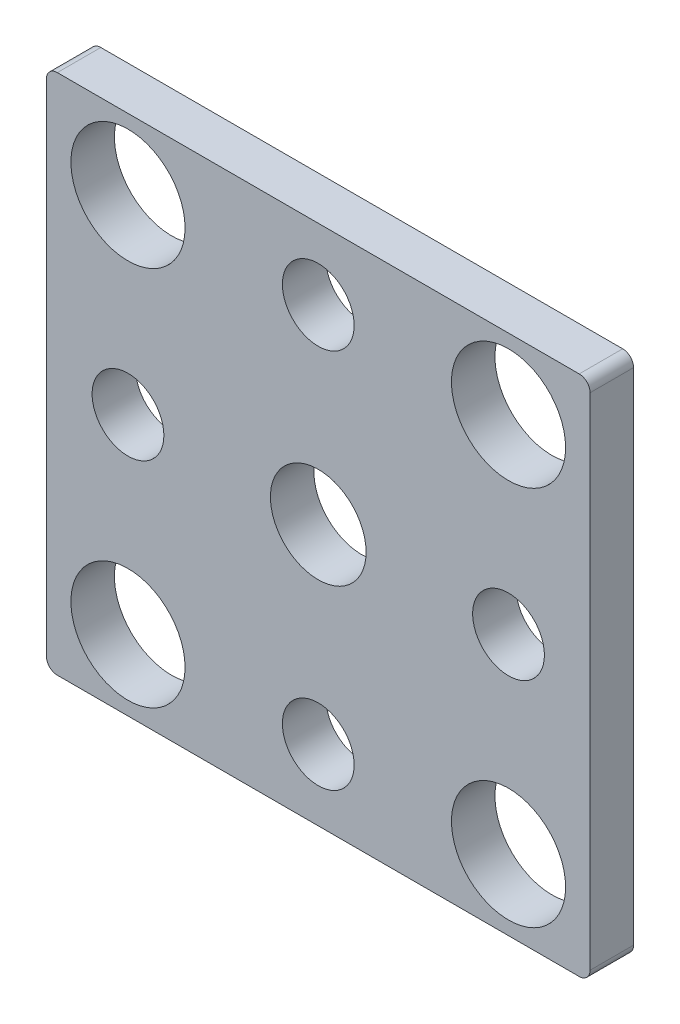
ISO-10303-21;
HEADER;
FILE_DESCRIPTION(('STEP AP214'),'2;1');
FILE_NAME('part.step','',(''),(''),'','','');
FILE_SCHEMA(('AUTOMOTIVE_DESIGN { 1 0 10303 214 1 1 1 1 }'));
ENDSEC;
DATA;
#1=APPLICATION_CONTEXT('core data for automotive mechanical design processes');
#2=APPLICATION_PROTOCOL_DEFINITION('international standard','automotive_design',2000,#1);
#3=PRODUCT_CONTEXT('',#1,'mechanical');
#4=PRODUCT('Part','Part','',(#3));
#5=PRODUCT_RELATED_PRODUCT_CATEGORY('part','',(#4));
#6=PRODUCT_DEFINITION_FORMATION('','',#4);
#7=PRODUCT_DEFINITION_CONTEXT('part definition',#1,'design');
#8=PRODUCT_DEFINITION('design','',#6,#7);
#9=PRODUCT_DEFINITION_SHAPE('','',#8);
#10=(LENGTH_UNIT() NAMED_UNIT(*) SI_UNIT(.MILLI.,.METRE.));
#11=(NAMED_UNIT(*) PLANE_ANGLE_UNIT() SI_UNIT($,.RADIAN.));
#12=(NAMED_UNIT(*) SI_UNIT($,.STERADIAN.) SOLID_ANGLE_UNIT());
#13=UNCERTAINTY_MEASURE_WITH_UNIT(LENGTH_MEASURE(1.E-05),#10,'distance_accuracy_value','');
#14=(GEOMETRIC_REPRESENTATION_CONTEXT(3) GLOBAL_UNCERTAINTY_ASSIGNED_CONTEXT((#13)) GLOBAL_UNIT_ASSIGNED_CONTEXT((#10,
#11,#12)) REPRESENTATION_CONTEXT('',''));
#15=CARTESIAN_POINT('',(0.,0.,0.));
#16=DIRECTION('',(0.,0.,1.));
#17=DIRECTION('',(1.,0.,0.));
#18=AXIS2_PLACEMENT_3D('',#15,#16,#17);
#19=CARTESIAN_POINT('',(0.,0.,4.));
#20=DIRECTION('',(0.,0.,-1.));
#21=DIRECTION('',(-1.,0.,0.));
#22=AXIS2_PLACEMENT_3D('',#19,#20,#21);
#23=PLANE('',#22);
#24=CARTESIAN_POINT('',(7.5,-24.,4.));
#25=DIRECTION('',(0.,0.,1.));
#26=DIRECTION('',(1.,0.,0.));
#27=AXIS2_PLACEMENT_3D('',#24,#25,#26);
#28=CIRCLE('',#27,3.3);
#29=CARTESIAN_POINT('',(10.8,-24.,4.));
#30=VERTEX_POINT('',#29);
#31=EDGE_CURVE('E230',#30,#30,#28,.T.);
#32=ORIENTED_EDGE('',*,*,#31,.F.);
#33=EDGE_LOOP('',(#32));
#34=FACE_BOUND('',#33,.T.);
#35=CARTESIAN_POINT('',(42.5,-24.,4.));
#36=DIRECTION('',(0.,0.,1.));
#37=DIRECTION('',(1.,0.,0.));
#38=AXIS2_PLACEMENT_3D('',#35,#36,#37);
#39=CIRCLE('',#38,3.3);
#40=CARTESIAN_POINT('',(45.8,-24.,4.));
#41=VERTEX_POINT('',#40);
#42=EDGE_CURVE('E224',#41,#41,#39,.T.);
#43=ORIENTED_EDGE('',*,*,#42,.F.);
#44=EDGE_LOOP('',(#43));
#45=FACE_BOUND('',#44,.T.);
#46=CARTESIAN_POINT('',(25.,-6.5,4.));
#47=DIRECTION('',(0.,0.,1.));
#48=DIRECTION('',(1.,0.,0.));
#49=AXIS2_PLACEMENT_3D('',#46,#47,#48);
#50=CIRCLE('',#49,3.3);
#51=CARTESIAN_POINT('',(28.3,-6.5,4.));
#52=VERTEX_POINT('',#51);
#53=EDGE_CURVE('E218',#52,#52,#50,.T.);
#54=ORIENTED_EDGE('',*,*,#53,.F.);
#55=EDGE_LOOP('',(#54));
#56=FACE_BOUND('',#55,.T.);
#57=CARTESIAN_POINT('',(25.,-41.5,4.));
#58=DIRECTION('',(0.,0.,1.));
#59=DIRECTION('',(1.,0.,0.));
#60=AXIS2_PLACEMENT_3D('',#57,#58,#59);
#61=CIRCLE('',#60,3.3);
#62=CARTESIAN_POINT('',(28.3,-41.5,4.));
#63=VERTEX_POINT('',#62);
#64=EDGE_CURVE('E212',#63,#63,#61,.T.);
#65=ORIENTED_EDGE('',*,*,#64,.F.);
#66=EDGE_LOOP('',(#65));
#67=FACE_BOUND('',#66,.T.);
#68=CARTESIAN_POINT('',(7.50000000000001,-41.5,4.));
#69=DIRECTION('',(0.,0.,1.));
#70=DIRECTION('',(1.,0.,0.));
#71=AXIS2_PLACEMENT_3D('',#68,#69,#70);
#72=CIRCLE('',#71,5.25);
#73=CARTESIAN_POINT('',(12.75,-41.5,4.));
#74=VERTEX_POINT('',#73);
#75=EDGE_CURVE('E195',#74,#74,#72,.T.);
#76=ORIENTED_EDGE('',*,*,#75,.F.);
#77=EDGE_LOOP('',(#76));
#78=FACE_BOUND('',#77,.T.);
#79=CARTESIAN_POINT('',(42.5,-41.5,4.));
#80=DIRECTION('',(0.,0.,1.));
#81=DIRECTION('',(1.,0.,0.));
#82=AXIS2_PLACEMENT_3D('',#79,#80,#81);
#83=CIRCLE('',#82,5.25);
#84=CARTESIAN_POINT('',(47.75,-41.5,4.));
#85=VERTEX_POINT('',#84);
#86=EDGE_CURVE('E201',#85,#85,#83,.F.);
#87=ORIENTED_EDGE('',*,*,#86,.T.);
#88=EDGE_LOOP('',(#87));
#89=FACE_BOUND('',#88,.T.);
#90=DIRECTION('',(1.,0.,0.));
#91=VECTOR('',#90,1.);
#92=CARTESIAN_POINT('',(50.,-48.,4.));
#93=LINE('',#92,#91);
#94=CARTESIAN_POINT('',(1.,-48.,4.));
#95=VERTEX_POINT('',#94);
#96=CARTESIAN_POINT('',(49.,-48.,4.));
#97=VERTEX_POINT('',#96);
#98=EDGE_CURVE('E172',#95,#97,#93,.T.);
#99=ORIENTED_EDGE('',*,*,#98,.T.);
#100=CARTESIAN_POINT('',(49.,-47.,4.));
#101=DIRECTION('',(0.,0.,-1.));
#102=DIRECTION('',(-1.,0.,0.));
#103=AXIS2_PLACEMENT_3D('',#100,#101,#102);
#104=CIRCLE('',#103,1.);
#105=CARTESIAN_POINT('',(50.,-47.,4.));
#106=VERTEX_POINT('',#105);
#107=EDGE_CURVE('E150',#97,#106,#104,.F.);
#108=ORIENTED_EDGE('',*,*,#107,.T.);
#109=DIRECTION('',(0.,1.,0.));
#110=VECTOR('',#109,1.);
#111=CARTESIAN_POINT('',(50.,0.,4.));
#112=LINE('',#111,#110);
#113=CARTESIAN_POINT('',(50.,-1.,4.));
#114=VERTEX_POINT('',#113);
#115=EDGE_CURVE('E120',#106,#114,#112,.T.);
#116=ORIENTED_EDGE('',*,*,#115,.T.);
#117=CARTESIAN_POINT('',(49.,-1.,4.));
#118=DIRECTION('',(0.,0.,-1.));
#119=DIRECTION('',(-1.,0.,0.));
#120=AXIS2_PLACEMENT_3D('',#117,#118,#119);
#121=CIRCLE('',#120,1.);
#122=CARTESIAN_POINT('',(49.,0.,4.));
#123=VERTEX_POINT('',#122);
#124=EDGE_CURVE('E56',#114,#123,#121,.F.);
#125=ORIENTED_EDGE('',*,*,#124,.T.);
#126=DIRECTION('',(-1.,0.,0.));
#127=VECTOR('',#126,1.);
#128=CARTESIAN_POINT('',(0.,0.,4.));
#129=LINE('',#128,#127);
#130=CARTESIAN_POINT('',(1.,0.,4.));
#131=VERTEX_POINT('',#130);
#132=EDGE_CURVE('E136',#123,#131,#129,.T.);
#133=ORIENTED_EDGE('',*,*,#132,.T.);
#134=CARTESIAN_POINT('',(1.,-1.,4.));
#135=DIRECTION('',(0.,0.,-1.));
#136=DIRECTION('',(-1.,0.,0.));
#137=AXIS2_PLACEMENT_3D('',#134,#135,#136);
#138=CIRCLE('',#137,1.);
#139=CARTESIAN_POINT('',(0.,-1.00000000000001,4.));
#140=VERTEX_POINT('',#139);
#141=EDGE_CURVE('E146',#131,#140,#138,.F.);
#142=ORIENTED_EDGE('',*,*,#141,.T.);
#143=DIRECTION('',(0.,-1.,0.));
#144=VECTOR('',#143,1.);
#145=CARTESIAN_POINT('',(0.,-48.,4.));
#146=LINE('',#145,#144);
#147=CARTESIAN_POINT('',(0.,-47.,4.));
#148=VERTEX_POINT('',#147);
#149=EDGE_CURVE('E130',#140,#148,#146,.T.);
#150=ORIENTED_EDGE('',*,*,#149,.T.);
#151=CARTESIAN_POINT('',(1.,-47.,4.));
#152=DIRECTION('',(0.,0.,-1.));
#153=DIRECTION('',(-1.,0.,0.));
#154=AXIS2_PLACEMENT_3D('',#151,#152,#153);
#155=CIRCLE('',#154,1.);
#156=EDGE_CURVE('E148',#148,#95,#155,.F.);
#157=ORIENTED_EDGE('',*,*,#156,.T.);
#158=EDGE_LOOP('',(#99,#108,#116,#125,#133,#142,#150,#157));
#159=FACE_BOUND('',#158,.T.);
#160=CARTESIAN_POINT('',(7.50000000000001,-6.5,4.));
#161=DIRECTION('',(0.,0.,1.));
#162=DIRECTION('',(1.,0.,0.));
#163=AXIS2_PLACEMENT_3D('',#160,#161,#162);
#164=CIRCLE('',#163,5.25);
#165=CARTESIAN_POINT('',(12.75,-6.5,4.));
#166=VERTEX_POINT('',#165);
#167=EDGE_CURVE('E177',#166,#166,#164,.F.);
#168=ORIENTED_EDGE('',*,*,#167,.T.);
#169=EDGE_LOOP('',(#168));
#170=FACE_BOUND('',#169,.T.);
#171=CARTESIAN_POINT('',(42.5,-6.5,4.));
#172=DIRECTION('',(0.,0.,1.));
#173=DIRECTION('',(1.,0.,0.));
#174=AXIS2_PLACEMENT_3D('',#171,#172,#173);
#175=CIRCLE('',#174,5.25);
#176=CARTESIAN_POINT('',(47.75,-6.5,4.));
#177=VERTEX_POINT('',#176);
#178=EDGE_CURVE('E207',#177,#177,#175,.T.);
#179=ORIENTED_EDGE('',*,*,#178,.F.);
#180=EDGE_LOOP('',(#179));
#181=FACE_BOUND('',#180,.T.);
#182=CARTESIAN_POINT('',(25.,-24.,4.));
#183=DIRECTION('',(0.,0.,1.));
#184=DIRECTION('',(1.,0.,0.));
#185=AXIS2_PLACEMENT_3D('',#182,#183,#184);
#186=CIRCLE('',#185,4.4);
#187=CARTESIAN_POINT('',(29.4,-24.,4.));
#188=VERTEX_POINT('',#187);
#189=EDGE_CURVE('E188',#188,#188,#186,.T.);
#190=ORIENTED_EDGE('',*,*,#189,.F.);
#191=EDGE_LOOP('',(#190));
#192=FACE_BOUND('',#191,.T.);
#193=ADVANCED_FACE('F36',(#34,#45,#56,#67,#78,#89,#159,#170,#181,#192),#23,.F.);
#194=CARTESIAN_POINT('',(0.,0.,0.));
#195=DIRECTION('',(0.,0.,-1.));
#196=DIRECTION('',(-1.,0.,0.));
#197=AXIS2_PLACEMENT_3D('',#194,#195,#196);
#198=PLANE('',#197);
#199=CARTESIAN_POINT('',(7.5,-24.,0.));
#200=DIRECTION('',(0.,0.,1.));
#201=DIRECTION('',(1.,0.,0.));
#202=AXIS2_PLACEMENT_3D('',#199,#200,#201);
#203=CIRCLE('',#202,3.3);
#204=CARTESIAN_POINT('',(10.8,-24.,0.));
#205=VERTEX_POINT('',#204);
#206=EDGE_CURVE('E192',#205,#205,#203,.T.);
#207=ORIENTED_EDGE('',*,*,#206,.T.);
#208=EDGE_LOOP('',(#207));
#209=FACE_BOUND('',#208,.T.);
#210=CARTESIAN_POINT('',(42.5,-24.,0.));
#211=DIRECTION('',(0.,0.,1.));
#212=DIRECTION('',(1.,0.,0.));
#213=AXIS2_PLACEMENT_3D('',#210,#211,#212);
#214=CIRCLE('',#213,3.3);
#215=CARTESIAN_POINT('',(45.8,-24.,0.));
#216=VERTEX_POINT('',#215);
#217=EDGE_CURVE('E227',#216,#216,#214,.T.);
#218=ORIENTED_EDGE('',*,*,#217,.T.);
#219=EDGE_LOOP('',(#218));
#220=FACE_BOUND('',#219,.T.);
#221=CARTESIAN_POINT('',(25.,-6.5,0.));
#222=DIRECTION('',(0.,0.,1.));
#223=DIRECTION('',(1.,0.,0.));
#224=AXIS2_PLACEMENT_3D('',#221,#222,#223);
#225=CIRCLE('',#224,3.3);
#226=CARTESIAN_POINT('',(28.3,-6.5,0.));
#227=VERTEX_POINT('',#226);
#228=EDGE_CURVE('E221',#227,#227,#225,.T.);
#229=ORIENTED_EDGE('',*,*,#228,.T.);
#230=EDGE_LOOP('',(#229));
#231=FACE_BOUND('',#230,.T.);
#232=CARTESIAN_POINT('',(25.,-41.5,0.));
#233=DIRECTION('',(0.,0.,1.));
#234=DIRECTION('',(1.,0.,0.));
#235=AXIS2_PLACEMENT_3D('',#232,#233,#234);
#236=CIRCLE('',#235,3.3);
#237=CARTESIAN_POINT('',(28.3,-41.5,0.));
#238=VERTEX_POINT('',#237);
#239=EDGE_CURVE('E215',#238,#238,#236,.T.);
#240=ORIENTED_EDGE('',*,*,#239,.T.);
#241=EDGE_LOOP('',(#240));
#242=FACE_BOUND('',#241,.T.);
#243=CARTESIAN_POINT('',(42.5,-41.5,0.));
#244=DIRECTION('',(0.,0.,1.));
#245=DIRECTION('',(1.,0.,0.));
#246=AXIS2_PLACEMENT_3D('',#243,#244,#245);
#247=CIRCLE('',#246,5.25);
#248=CARTESIAN_POINT('',(47.75,-41.5,0.));
#249=VERTEX_POINT('',#248);
#250=EDGE_CURVE('E204',#249,#249,#247,.F.);
#251=ORIENTED_EDGE('',*,*,#250,.F.);
#252=EDGE_LOOP('',(#251));
#253=FACE_BOUND('',#252,.T.);
#254=CARTESIAN_POINT('',(7.50000000000001,-6.5,0.));
#255=DIRECTION('',(0.,0.,1.));
#256=DIRECTION('',(1.,0.,0.));
#257=AXIS2_PLACEMENT_3D('',#254,#255,#256);
#258=CIRCLE('',#257,5.25);
#259=CARTESIAN_POINT('',(12.75,-6.5,0.));
#260=VERTEX_POINT('',#259);
#261=EDGE_CURVE('E181',#260,#260,#258,.F.);
#262=ORIENTED_EDGE('',*,*,#261,.F.);
#263=EDGE_LOOP('',(#262));
#264=FACE_BOUND('',#263,.T.);
#265=DIRECTION('',(0.,1.,0.));
#266=VECTOR('',#265,1.);
#267=CARTESIAN_POINT('',(50.,0.,0.));
#268=LINE('',#267,#266);
#269=CARTESIAN_POINT('',(50.,-47.,0.));
#270=VERTEX_POINT('',#269);
#271=CARTESIAN_POINT('',(50.,-1.,0.));
#272=VERTEX_POINT('',#271);
#273=EDGE_CURVE('E118',#270,#272,#268,.T.);
#274=ORIENTED_EDGE('',*,*,#273,.F.);
#275=CARTESIAN_POINT('',(49.,-47.,0.));
#276=DIRECTION('',(0.,0.,-1.));
#277=DIRECTION('',(-1.,0.,0.));
#278=AXIS2_PLACEMENT_3D('',#275,#276,#277);
#279=CIRCLE('',#278,1.);
#280=CARTESIAN_POINT('',(49.,-48.,0.));
#281=VERTEX_POINT('',#280);
#282=EDGE_CURVE('E101',#270,#281,#279,.T.);
#283=ORIENTED_EDGE('',*,*,#282,.T.);
#284=DIRECTION('',(1.,0.,0.));
#285=VECTOR('',#284,1.);
#286=CARTESIAN_POINT('',(50.,-48.,0.));
#287=LINE('',#286,#285);
#288=CARTESIAN_POINT('',(1.,-48.,0.));
#289=VERTEX_POINT('',#288);
#290=EDGE_CURVE('E128',#289,#281,#287,.T.);
#291=ORIENTED_EDGE('',*,*,#290,.F.);
#292=CARTESIAN_POINT('',(1.,-47.,0.));
#293=DIRECTION('',(0.,0.,-1.));
#294=DIRECTION('',(-1.,0.,0.));
#295=AXIS2_PLACEMENT_3D('',#292,#293,#294);
#296=CIRCLE('',#295,1.);
#297=CARTESIAN_POINT('',(0.,-47.,0.));
#298=VERTEX_POINT('',#297);
#299=EDGE_CURVE('E112',#289,#298,#296,.T.);
#300=ORIENTED_EDGE('',*,*,#299,.T.);
#301=DIRECTION('',(0.,-1.,0.));
#302=VECTOR('',#301,1.);
#303=CARTESIAN_POINT('',(0.,-48.,0.));
#304=LINE('',#303,#302);
#305=CARTESIAN_POINT('',(0.,-1.00000000000001,0.));
#306=VERTEX_POINT('',#305);
#307=EDGE_CURVE('E132',#306,#298,#304,.T.);
#308=ORIENTED_EDGE('',*,*,#307,.F.);
#309=CARTESIAN_POINT('',(1.,-1.,0.));
#310=DIRECTION('',(0.,0.,-1.));
#311=DIRECTION('',(-1.,0.,0.));
#312=AXIS2_PLACEMENT_3D('',#309,#310,#311);
#313=CIRCLE('',#312,1.);
#314=CARTESIAN_POINT('',(1.,0.,0.));
#315=VERTEX_POINT('',#314);
#316=EDGE_CURVE('E139',#306,#315,#313,.T.);
#317=ORIENTED_EDGE('',*,*,#316,.T.);
#318=DIRECTION('',(-1.,0.,0.));
#319=VECTOR('',#318,1.);
#320=CARTESIAN_POINT('',(0.,0.,0.));
#321=LINE('',#320,#319);
#322=CARTESIAN_POINT('',(49.,0.,0.));
#323=VERTEX_POINT('',#322);
#324=EDGE_CURVE('E127',#323,#315,#321,.T.);
#325=ORIENTED_EDGE('',*,*,#324,.F.);
#326=CARTESIAN_POINT('',(49.,-1.,0.));
#327=DIRECTION('',(0.,0.,-1.));
#328=DIRECTION('',(-1.,0.,0.));
#329=AXIS2_PLACEMENT_3D('',#326,#327,#328);
#330=CIRCLE('',#329,1.);
#331=EDGE_CURVE('E121',#323,#272,#330,.T.);
#332=ORIENTED_EDGE('',*,*,#331,.T.);
#333=EDGE_LOOP('',(#274,#283,#291,#300,#308,#317,#325,#332));
#334=FACE_BOUND('',#333,.T.);
#335=CARTESIAN_POINT('',(42.5,-6.5,0.));
#336=DIRECTION('',(0.,0.,1.));
#337=DIRECTION('',(1.,0.,0.));
#338=AXIS2_PLACEMENT_3D('',#335,#336,#337);
#339=CIRCLE('',#338,5.25);
#340=CARTESIAN_POINT('',(47.75,-6.5,0.));
#341=VERTEX_POINT('',#340);
#342=EDGE_CURVE('E186',#341,#341,#339,.T.);
#343=ORIENTED_EDGE('',*,*,#342,.T.);
#344=EDGE_LOOP('',(#343));
#345=FACE_BOUND('',#344,.T.);
#346=CARTESIAN_POINT('',(7.50000000000001,-41.5,0.));
#347=DIRECTION('',(0.,0.,1.));
#348=DIRECTION('',(1.,0.,0.));
#349=AXIS2_PLACEMENT_3D('',#346,#347,#348);
#350=CIRCLE('',#349,5.25);
#351=CARTESIAN_POINT('',(12.75,-41.5,0.));
#352=VERTEX_POINT('',#351);
#353=EDGE_CURVE('E198',#352,#352,#350,.T.);
#354=ORIENTED_EDGE('',*,*,#353,.T.);
#355=EDGE_LOOP('',(#354));
#356=FACE_BOUND('',#355,.T.);
#357=CARTESIAN_POINT('',(25.,-24.,0.));
#358=DIRECTION('',(0.,0.,1.));
#359=DIRECTION('',(1.,0.,0.));
#360=AXIS2_PLACEMENT_3D('',#357,#358,#359);
#361=CIRCLE('',#360,4.4);
#362=CARTESIAN_POINT('',(29.4,-24.,0.));
#363=VERTEX_POINT('',#362);
#364=EDGE_CURVE('E191',#363,#363,#361,.T.);
#365=ORIENTED_EDGE('',*,*,#364,.T.);
#366=EDGE_LOOP('',(#365));
#367=FACE_BOUND('',#366,.T.);
#368=ADVANCED_FACE('F124',(#209,#220,#231,#242,#253,#264,#334,#345,#356,#367),#198,.T.);
#369=CARTESIAN_POINT('',(0.,-48.,4.));
#370=DIRECTION('',(1.,0.,0.));
#371=DIRECTION('',(0.,1.,0.));
#372=AXIS2_PLACEMENT_3D('',#369,#370,#371);
#373=PLANE('',#372);
#374=ORIENTED_EDGE('',*,*,#307,.T.);
#375=DIRECTION('',(0.,0.,-1.));
#376=VECTOR('',#375,1.);
#377=CARTESIAN_POINT('',(0.,-47.,4.));
#378=LINE('',#377,#376);
#379=EDGE_CURVE('E155',#298,#148,#378,.F.);
#380=ORIENTED_EDGE('',*,*,#379,.T.);
#381=ORIENTED_EDGE('',*,*,#149,.F.);
#382=DIRECTION('',(0.,0.,-1.));
#383=VECTOR('',#382,1.);
#384=CARTESIAN_POINT('',(0.,-1.,4.));
#385=LINE('',#384,#383);
#386=EDGE_CURVE('E152',#140,#306,#385,.T.);
#387=ORIENTED_EDGE('',*,*,#386,.T.);
#388=EDGE_LOOP('',(#374,#380,#381,#387));
#389=FACE_BOUND('',#388,.T.);
#390=ADVANCED_FACE('F168',(#389),#373,.F.);
#391=CARTESIAN_POINT('',(50.,-48.,4.));
#392=DIRECTION('',(0.,1.,0.));
#393=DIRECTION('',(-1.,0.,0.));
#394=AXIS2_PLACEMENT_3D('',#391,#392,#393);
#395=PLANE('',#394);
#396=ORIENTED_EDGE('',*,*,#290,.T.);
#397=DIRECTION('',(0.,0.,-1.));
#398=VECTOR('',#397,1.);
#399=CARTESIAN_POINT('',(49.,-48.,4.));
#400=LINE('',#399,#398);
#401=EDGE_CURVE('E106',#281,#97,#400,.F.);
#402=ORIENTED_EDGE('',*,*,#401,.T.);
#403=ORIENTED_EDGE('',*,*,#98,.F.);
#404=DIRECTION('',(0.,0.,-1.));
#405=VECTOR('',#404,1.);
#406=CARTESIAN_POINT('',(1.,-48.,4.));
#407=LINE('',#406,#405);
#408=EDGE_CURVE('E111',#95,#289,#407,.T.);
#409=ORIENTED_EDGE('',*,*,#408,.T.);
#410=EDGE_LOOP('',(#396,#402,#403,#409));
#411=FACE_BOUND('',#410,.T.);
#412=ADVANCED_FACE('F294',(#411),#395,.F.);
#413=CARTESIAN_POINT('',(50.,0.,4.));
#414=DIRECTION('',(-1.,0.,0.));
#415=DIRECTION('',(0.,-1.,0.));
#416=AXIS2_PLACEMENT_3D('',#413,#414,#415);
#417=PLANE('',#416);
#418=ORIENTED_EDGE('',*,*,#115,.F.);
#419=DIRECTION('',(0.,0.,-1.));
#420=VECTOR('',#419,1.);
#421=CARTESIAN_POINT('',(50.,-47.,4.));
#422=LINE('',#421,#420);
#423=EDGE_CURVE('E105',#106,#270,#422,.T.);
#424=ORIENTED_EDGE('',*,*,#423,.T.);
#425=ORIENTED_EDGE('',*,*,#273,.T.);
#426=DIRECTION('',(0.,0.,-1.));
#427=VECTOR('',#426,1.);
#428=CARTESIAN_POINT('',(50.,-1.,4.));
#429=LINE('',#428,#427);
#430=EDGE_CURVE('E122',#272,#114,#429,.F.);
#431=ORIENTED_EDGE('',*,*,#430,.T.);
#432=EDGE_LOOP('',(#418,#424,#425,#431));
#433=FACE_BOUND('',#432,.T.);
#434=ADVANCED_FACE('F117',(#433),#417,.F.);
#435=CARTESIAN_POINT('',(0.,0.,4.));
#436=DIRECTION('',(0.,-1.,0.));
#437=DIRECTION('',(0.,0.,-1.));
#438=AXIS2_PLACEMENT_3D('',#435,#436,#437);
#439=PLANE('',#438);
#440=ORIENTED_EDGE('',*,*,#324,.T.);
#441=DIRECTION('',(0.,0.,-1.));
#442=VECTOR('',#441,1.);
#443=CARTESIAN_POINT('',(1.,0.,4.));
#444=LINE('',#443,#442);
#445=EDGE_CURVE('E11',#315,#131,#444,.F.);
#446=ORIENTED_EDGE('',*,*,#445,.T.);
#447=ORIENTED_EDGE('',*,*,#132,.F.);
#448=DIRECTION('',(0.,0.,-1.));
#449=VECTOR('',#448,1.);
#450=CARTESIAN_POINT('',(49.,0.,4.));
#451=LINE('',#450,#449);
#452=EDGE_CURVE('E44',#123,#323,#451,.T.);
#453=ORIENTED_EDGE('',*,*,#452,.T.);
#454=EDGE_LOOP('',(#440,#446,#447,#453));
#455=FACE_BOUND('',#454,.T.);
#456=ADVANCED_FACE('F158',(#455),#439,.F.);
#457=CARTESIAN_POINT('',(49.,-47.,4.));
#458=DIRECTION('',(0.,0.,-1.));
#459=DIRECTION('',(-1.,0.,0.));
#460=AXIS2_PLACEMENT_3D('',#457,#458,#459);
#461=CYLINDRICAL_SURFACE('',#460,1.);
#462=ORIENTED_EDGE('',*,*,#107,.F.);
#463=ORIENTED_EDGE('',*,*,#401,.F.);
#464=ORIENTED_EDGE('',*,*,#282,.F.);
#465=ORIENTED_EDGE('',*,*,#423,.F.);
#466=EDGE_LOOP('',(#462,#463,#464,#465));
#467=FACE_BOUND('',#466,.T.);
#468=ADVANCED_FACE('F104',(#467),#461,.T.);
#469=CARTESIAN_POINT('',(1.,-47.,4.));
#470=DIRECTION('',(0.,0.,-1.));
#471=DIRECTION('',(-1.,0.,0.));
#472=AXIS2_PLACEMENT_3D('',#469,#470,#471);
#473=CYLINDRICAL_SURFACE('',#472,1.);
#474=ORIENTED_EDGE('',*,*,#156,.F.);
#475=ORIENTED_EDGE('',*,*,#379,.F.);
#476=ORIENTED_EDGE('',*,*,#299,.F.);
#477=ORIENTED_EDGE('',*,*,#408,.F.);
#478=EDGE_LOOP('',(#474,#475,#476,#477));
#479=FACE_BOUND('',#478,.T.);
#480=ADVANCED_FACE('F302',(#479),#473,.T.);
#481=CARTESIAN_POINT('',(1.,-1.,4.));
#482=DIRECTION('',(0.,0.,-1.));
#483=DIRECTION('',(-1.,0.,0.));
#484=AXIS2_PLACEMENT_3D('',#481,#482,#483);
#485=CYLINDRICAL_SURFACE('',#484,1.);
#486=ORIENTED_EDGE('',*,*,#141,.F.);
#487=ORIENTED_EDGE('',*,*,#445,.F.);
#488=ORIENTED_EDGE('',*,*,#316,.F.);
#489=ORIENTED_EDGE('',*,*,#386,.F.);
#490=EDGE_LOOP('',(#486,#487,#488,#489));
#491=FACE_BOUND('',#490,.T.);
#492=ADVANCED_FACE('F165',(#491),#485,.T.);
#493=CARTESIAN_POINT('',(49.,-1.,4.));
#494=DIRECTION('',(0.,0.,-1.));
#495=DIRECTION('',(-1.,0.,0.));
#496=AXIS2_PLACEMENT_3D('',#493,#494,#495);
#497=CYLINDRICAL_SURFACE('',#496,1.);
#498=ORIENTED_EDGE('',*,*,#124,.F.);
#499=ORIENTED_EDGE('',*,*,#430,.F.);
#500=ORIENTED_EDGE('',*,*,#331,.F.);
#501=ORIENTED_EDGE('',*,*,#452,.F.);
#502=EDGE_LOOP('',(#498,#499,#500,#501));
#503=FACE_BOUND('',#502,.T.);
#504=ADVANCED_FACE('F38',(#503),#497,.T.);
#505=CARTESIAN_POINT('',(7.50000000000001,-6.5,0.));
#506=DIRECTION('',(0.,0.,1.));
#507=DIRECTION('',(1.,0.,0.));
#508=AXIS2_PLACEMENT_3D('',#505,#506,#507);
#509=CYLINDRICAL_SURFACE('',#508,5.25);
#510=ORIENTED_EDGE('',*,*,#261,.T.);
#511=EDGE_LOOP('',(#510));
#512=FACE_BOUND('',#511,.T.);
#513=ORIENTED_EDGE('',*,*,#167,.F.);
#514=EDGE_LOOP('',(#513));
#515=FACE_BOUND('',#514,.T.);
#516=ADVANCED_FACE('F284',(#512,#515),#509,.F.);
#517=CARTESIAN_POINT('',(42.5,-6.5,0.));
#518=DIRECTION('',(0.,0.,1.));
#519=DIRECTION('',(1.,0.,0.));
#520=AXIS2_PLACEMENT_3D('',#517,#518,#519);
#521=CYLINDRICAL_SURFACE('',#520,5.25);
#522=ORIENTED_EDGE('',*,*,#342,.F.);
#523=EDGE_LOOP('',(#522));
#524=FACE_BOUND('',#523,.T.);
#525=ORIENTED_EDGE('',*,*,#178,.T.);
#526=EDGE_LOOP('',(#525));
#527=FACE_BOUND('',#526,.T.);
#528=ADVANCED_FACE('F286',(#524,#527),#521,.F.);
#529=CARTESIAN_POINT('',(42.5,-41.5,0.));
#530=DIRECTION('',(0.,0.,1.));
#531=DIRECTION('',(1.,0.,0.));
#532=AXIS2_PLACEMENT_3D('',#529,#530,#531);
#533=CYLINDRICAL_SURFACE('',#532,5.25);
#534=ORIENTED_EDGE('',*,*,#250,.T.);
#535=EDGE_LOOP('',(#534));
#536=FACE_BOUND('',#535,.T.);
#537=ORIENTED_EDGE('',*,*,#86,.F.);
#538=EDGE_LOOP('',(#537));
#539=FACE_BOUND('',#538,.T.);
#540=ADVANCED_FACE('F278',(#536,#539),#533,.F.);
#541=CARTESIAN_POINT('',(7.50000000000001,-41.5,0.));
#542=DIRECTION('',(0.,0.,1.));
#543=DIRECTION('',(1.,0.,0.));
#544=AXIS2_PLACEMENT_3D('',#541,#542,#543);
#545=CYLINDRICAL_SURFACE('',#544,5.25);
#546=ORIENTED_EDGE('',*,*,#353,.F.);
#547=EDGE_LOOP('',(#546));
#548=FACE_BOUND('',#547,.T.);
#549=ORIENTED_EDGE('',*,*,#75,.T.);
#550=EDGE_LOOP('',(#549));
#551=FACE_BOUND('',#550,.T.);
#552=ADVANCED_FACE('F268',(#548,#551),#545,.F.);
#553=CARTESIAN_POINT('',(25.,-24.,0.));
#554=DIRECTION('',(0.,0.,1.));
#555=DIRECTION('',(1.,0.,0.));
#556=AXIS2_PLACEMENT_3D('',#553,#554,#555);
#557=CYLINDRICAL_SURFACE('',#556,4.4);
#558=ORIENTED_EDGE('',*,*,#364,.F.);
#559=EDGE_LOOP('',(#558));
#560=FACE_BOUND('',#559,.T.);
#561=ORIENTED_EDGE('',*,*,#189,.T.);
#562=EDGE_LOOP('',(#561));
#563=FACE_BOUND('',#562,.T.);
#564=ADVANCED_FACE('F265',(#560,#563),#557,.F.);
#565=CARTESIAN_POINT('',(25.,-41.5,0.));
#566=DIRECTION('',(0.,0.,1.));
#567=DIRECTION('',(1.,0.,0.));
#568=AXIS2_PLACEMENT_3D('',#565,#566,#567);
#569=CYLINDRICAL_SURFACE('',#568,3.3);
#570=ORIENTED_EDGE('',*,*,#239,.F.);
#571=EDGE_LOOP('',(#570));
#572=FACE_BOUND('',#571,.T.);
#573=ORIENTED_EDGE('',*,*,#64,.T.);
#574=EDGE_LOOP('',(#573));
#575=FACE_BOUND('',#574,.T.);
#576=ADVANCED_FACE('F267',(#572,#575),#569,.F.);
#577=CARTESIAN_POINT('',(25.,-6.5,0.));
#578=DIRECTION('',(0.,0.,1.));
#579=DIRECTION('',(1.,0.,0.));
#580=AXIS2_PLACEMENT_3D('',#577,#578,#579);
#581=CYLINDRICAL_SURFACE('',#580,3.3);
#582=ORIENTED_EDGE('',*,*,#228,.F.);
#583=EDGE_LOOP('',(#582));
#584=FACE_BOUND('',#583,.T.);
#585=ORIENTED_EDGE('',*,*,#53,.T.);
#586=EDGE_LOOP('',(#585));
#587=FACE_BOUND('',#586,.T.);
#588=ADVANCED_FACE('F275',(#584,#587),#581,.F.);
#589=CARTESIAN_POINT('',(42.5,-24.,0.));
#590=DIRECTION('',(0.,0.,1.));
#591=DIRECTION('',(1.,0.,0.));
#592=AXIS2_PLACEMENT_3D('',#589,#590,#591);
#593=CYLINDRICAL_SURFACE('',#592,3.3);
#594=ORIENTED_EDGE('',*,*,#217,.F.);
#595=EDGE_LOOP('',(#594));
#596=FACE_BOUND('',#595,.T.);
#597=ORIENTED_EDGE('',*,*,#42,.T.);
#598=EDGE_LOOP('',(#597));
#599=FACE_BOUND('',#598,.T.);
#600=ADVANCED_FACE('F241',(#596,#599),#593,.F.);
#601=CARTESIAN_POINT('',(7.5,-24.,0.));
#602=DIRECTION('',(0.,0.,1.));
#603=DIRECTION('',(1.,0.,0.));
#604=AXIS2_PLACEMENT_3D('',#601,#602,#603);
#605=CYLINDRICAL_SURFACE('',#604,3.3);
#606=ORIENTED_EDGE('',*,*,#206,.F.);
#607=EDGE_LOOP('',(#606));
#608=FACE_BOUND('',#607,.T.);
#609=ORIENTED_EDGE('',*,*,#31,.T.);
#610=EDGE_LOOP('',(#609));
#611=FACE_BOUND('',#610,.T.);
#612=ADVANCED_FACE('F238',(#608,#611),#605,.F.);
#613=CLOSED_SHELL('',(#193,#368,#390,#412,#434,#456,#468,#480,#492,#504,#516,#528,#540,#552,
#564,#576,#588,#600,#612));
#614=MANIFOLD_SOLID_BREP('B2',#613);
#615=ADVANCED_BREP_SHAPE_REPRESENTATION('',(#18,#614),#14);
#616=SHAPE_DEFINITION_REPRESENTATION(#9,#615);
ENDSEC;
END-ISO-10303-21;
